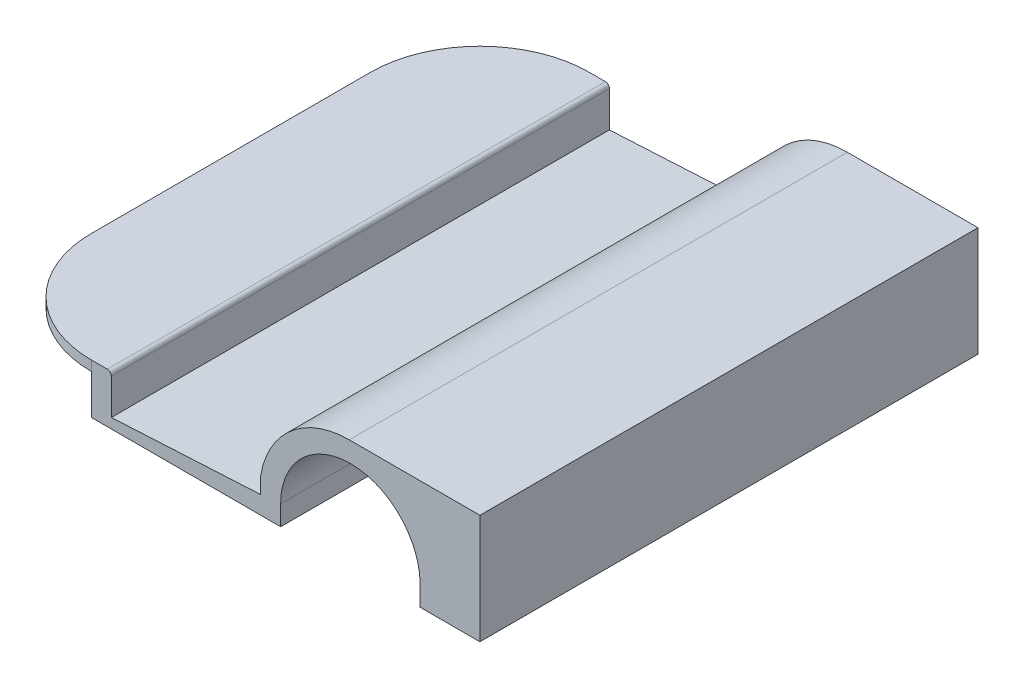
ISO-10303-21;
HEADER;
FILE_DESCRIPTION(('STEP AP214'),'2;1');
FILE_NAME('part.step','',(''),(''),'','','');
FILE_SCHEMA(('AUTOMOTIVE_DESIGN { 1 0 10303 214 1 1 1 1 }'));
ENDSEC;
DATA;
#1=APPLICATION_CONTEXT('core data for automotive mechanical design processes');
#2=APPLICATION_PROTOCOL_DEFINITION('international standard','automotive_design',2000,#1);
#3=PRODUCT_CONTEXT('',#1,'mechanical');
#4=PRODUCT('Part','Part','',(#3));
#5=PRODUCT_RELATED_PRODUCT_CATEGORY('part','',(#4));
#6=PRODUCT_DEFINITION_FORMATION('','',#4);
#7=PRODUCT_DEFINITION_CONTEXT('part definition',#1,'design');
#8=PRODUCT_DEFINITION('design','',#6,#7);
#9=PRODUCT_DEFINITION_SHAPE('','',#8);
#10=(LENGTH_UNIT() NAMED_UNIT(*) SI_UNIT(.MILLI.,.METRE.));
#11=(NAMED_UNIT(*) PLANE_ANGLE_UNIT() SI_UNIT($,.RADIAN.));
#12=(NAMED_UNIT(*) SI_UNIT($,.STERADIAN.) SOLID_ANGLE_UNIT());
#13=UNCERTAINTY_MEASURE_WITH_UNIT(LENGTH_MEASURE(1.E-05),#10,'distance_accuracy_value','');
#14=(GEOMETRIC_REPRESENTATION_CONTEXT(3) GLOBAL_UNCERTAINTY_ASSIGNED_CONTEXT((#13)) GLOBAL_UNIT_ASSIGNED_CONTEXT((#10,
#11,#12)) REPRESENTATION_CONTEXT('',''));
#15=CARTESIAN_POINT('',(0.,0.,0.));
#16=DIRECTION('',(0.,0.,1.));
#17=DIRECTION('',(1.,0.,0.));
#18=AXIS2_PLACEMENT_3D('',#15,#16,#17);
#19=CARTESIAN_POINT('',(0.,0.,250.));
#20=DIRECTION('',(1.,0.,0.));
#21=DIRECTION('',(0.,0.,-1.));
#22=AXIS2_PLACEMENT_3D('',#19,#20,#21);
#23=PLANE('',#22);
#24=DIRECTION('',(0.,0.,-1.));
#25=VECTOR('',#24,1.);
#26=CARTESIAN_POINT('',(0.,5.,250.));
#27=LINE('',#26,#25);
#28=CARTESIAN_POINT('',(0.,5.,195.));
#29=VERTEX_POINT('',#28);
#30=CARTESIAN_POINT('',(0.,5.,55.));
#31=VERTEX_POINT('',#30);
#32=EDGE_CURVE('E239',#29,#31,#27,.T.);
#33=ORIENTED_EDGE('',*,*,#32,.T.);
#34=DIRECTION('',(0.,-1.,0.));
#35=VECTOR('',#34,1.);
#36=CARTESIAN_POINT('',(0.,0.,55.));
#37=LINE('',#36,#35);
#38=CARTESIAN_POINT('',(0.,0.,55.));
#39=VERTEX_POINT('',#38);
#40=EDGE_CURVE('E171',#31,#39,#37,.T.);
#41=ORIENTED_EDGE('',*,*,#40,.T.);
#42=DIRECTION('',(0.,0.,-1.));
#43=VECTOR('',#42,1.);
#44=CARTESIAN_POINT('',(0.,0.,250.));
#45=LINE('',#44,#43);
#46=CARTESIAN_POINT('',(0.,0.,195.));
#47=VERTEX_POINT('',#46);
#48=EDGE_CURVE('E191',#47,#39,#45,.T.);
#49=ORIENTED_EDGE('',*,*,#48,.F.);
#50=DIRECTION('',(0.,-1.,0.));
#51=VECTOR('',#50,1.);
#52=CARTESIAN_POINT('',(0.,5.,195.));
#53=LINE('',#52,#51);
#54=EDGE_CURVE('E164',#47,#29,#53,.F.);
#55=ORIENTED_EDGE('',*,*,#54,.T.);
#56=EDGE_LOOP('',(#33,#41,#49,#55));
#57=FACE_BOUND('',#56,.T.);
#58=ADVANCED_FACE('F39',(#57),#23,.F.);
#59=CARTESIAN_POINT('',(0.,0.,250.));
#60=DIRECTION('',(0.,1.,0.));
#61=DIRECTION('',(0.,0.,1.));
#62=AXIS2_PLACEMENT_3D('',#59,#60,#61);
#63=PLANE('',#62);
#64=ORIENTED_EDGE('',*,*,#48,.T.);
#65=CARTESIAN_POINT('',(55.,0.,55.));
#66=DIRECTION('',(0.,1.,0.));
#67=DIRECTION('',(0.,0.,1.));
#68=AXIS2_PLACEMENT_3D('',#65,#66,#67);
#69=CIRCLE('',#68,55.);
#70=CARTESIAN_POINT('',(55.,0.,0.));
#71=VERTEX_POINT('',#70);
#72=EDGE_CURVE('E170',#39,#71,#69,.F.);
#73=ORIENTED_EDGE('',*,*,#72,.T.);
#74=DIRECTION('',(0.,0.,-1.));
#75=VECTOR('',#74,1.);
#76=CARTESIAN_POINT('',(55.,0.,250.));
#77=LINE('',#76,#75);
#78=CARTESIAN_POINT('',(55.,0.,250.));
#79=VERTEX_POINT('',#78);
#80=EDGE_CURVE('E186',#79,#71,#77,.T.);
#81=ORIENTED_EDGE('',*,*,#80,.F.);
#82=CARTESIAN_POINT('',(55.,0.,195.));
#83=DIRECTION('',(0.,1.,0.));
#84=DIRECTION('',(0.,0.,1.));
#85=AXIS2_PLACEMENT_3D('',#82,#83,#84);
#86=CIRCLE('',#85,55.);
#87=EDGE_CURVE('E159',#79,#47,#86,.F.);
#88=ORIENTED_EDGE('',*,*,#87,.T.);
#89=EDGE_LOOP('',(#64,#73,#81,#88));
#90=FACE_BOUND('',#89,.T.);
#91=ADVANCED_FACE('F187',(#90),#63,.F.);
#92=CARTESIAN_POINT('',(55.,0.,250.));
#93=DIRECTION('',(1.,0.,0.));
#94=DIRECTION('',(0.,0.,-1.));
#95=AXIS2_PLACEMENT_3D('',#92,#93,#94);
#96=PLANE('',#95);
#97=DIRECTION('',(0.,-1.,0.));
#98=VECTOR('',#97,1.);
#99=CARTESIAN_POINT('',(55.,0.,0.));
#100=LINE('',#99,#98);
#101=CARTESIAN_POINT('',(55.,-20.,0.));
#102=VERTEX_POINT('',#101);
#103=EDGE_CURVE('E240',#71,#102,#100,.T.);
#104=ORIENTED_EDGE('',*,*,#103,.T.);
#105=DIRECTION('',(0.,0.,-1.));
#106=VECTOR('',#105,1.);
#107=CARTESIAN_POINT('',(55.,-20.,250.));
#108=LINE('',#107,#106);
#109=CARTESIAN_POINT('',(55.,-20.,250.));
#110=VERTEX_POINT('',#109);
#111=EDGE_CURVE('E192',#110,#102,#108,.T.);
#112=ORIENTED_EDGE('',*,*,#111,.F.);
#113=DIRECTION('',(0.,-1.,0.));
#114=VECTOR('',#113,1.);
#115=CARTESIAN_POINT('',(55.,0.,250.));
#116=LINE('',#115,#114);
#117=EDGE_CURVE('E176',#79,#110,#116,.T.);
#118=ORIENTED_EDGE('',*,*,#117,.F.);
#119=ORIENTED_EDGE('',*,*,#80,.T.);
#120=EDGE_LOOP('',(#104,#112,#118,#119));
#121=FACE_BOUND('',#120,.T.);
#122=ADVANCED_FACE('F194',(#121),#96,.F.);
#123=CARTESIAN_POINT('',(55.,-20.,250.));
#124=DIRECTION('',(0.,1.,0.));
#125=DIRECTION('',(0.,0.,1.));
#126=AXIS2_PLACEMENT_3D('',#123,#124,#125);
#127=PLANE('',#126);
#128=DIRECTION('',(1.,0.,0.));
#129=VECTOR('',#128,1.);
#130=CARTESIAN_POINT('',(55.,-20.,0.));
#131=LINE('',#130,#129);
#132=CARTESIAN_POINT('',(150.,-20.,0.));
#133=VERTEX_POINT('',#132);
#134=EDGE_CURVE('E243',#102,#133,#131,.T.);
#135=ORIENTED_EDGE('',*,*,#134,.T.);
#136=DIRECTION('',(0.,0.,-1.));
#137=VECTOR('',#136,1.);
#138=CARTESIAN_POINT('',(150.,-20.,250.));
#139=LINE('',#138,#137);
#140=CARTESIAN_POINT('',(150.,-20.,250.));
#141=VERTEX_POINT('',#140);
#142=EDGE_CURVE('E314',#141,#133,#139,.T.);
#143=ORIENTED_EDGE('',*,*,#142,.F.);
#144=DIRECTION('',(1.,0.,0.));
#145=VECTOR('',#144,1.);
#146=CARTESIAN_POINT('',(55.,-20.,250.));
#147=LINE('',#146,#145);
#148=EDGE_CURVE('E198',#110,#141,#147,.T.);
#149=ORIENTED_EDGE('',*,*,#148,.F.);
#150=ORIENTED_EDGE('',*,*,#111,.T.);
#151=EDGE_LOOP('',(#135,#143,#149,#150));
#152=FACE_BOUND('',#151,.T.);
#153=ADVANCED_FACE('F420',(#152),#127,.F.);
#154=CARTESIAN_POINT('',(150.,-20.,250.));
#155=DIRECTION('',(-1.,0.,0.));
#156=DIRECTION('',(0.,-1.,0.));
#157=AXIS2_PLACEMENT_3D('',#154,#155,#156);
#158=PLANE('',#157);
#159=DIRECTION('',(0.,1.,0.));
#160=VECTOR('',#159,1.);
#161=CARTESIAN_POINT('',(150.,-20.,0.));
#162=LINE('',#161,#160);
#163=CARTESIAN_POINT('',(150.,-10.,0.));
#164=VERTEX_POINT('',#163);
#165=EDGE_CURVE('E246',#133,#164,#162,.T.);
#166=ORIENTED_EDGE('',*,*,#165,.T.);
#167=DIRECTION('',(0.,0.,-1.));
#168=VECTOR('',#167,1.);
#169=CARTESIAN_POINT('',(150.,-10.,250.));
#170=LINE('',#169,#168);
#171=CARTESIAN_POINT('',(150.,-10.,250.));
#172=VERTEX_POINT('',#171);
#173=EDGE_CURVE('E310',#172,#164,#170,.T.);
#174=ORIENTED_EDGE('',*,*,#173,.F.);
#175=DIRECTION('',(0.,1.,0.));
#176=VECTOR('',#175,1.);
#177=CARTESIAN_POINT('',(150.,-20.,250.));
#178=LINE('',#177,#176);
#179=EDGE_CURVE('E203',#141,#172,#178,.T.);
#180=ORIENTED_EDGE('',*,*,#179,.F.);
#181=ORIENTED_EDGE('',*,*,#142,.T.);
#182=EDGE_LOOP('',(#166,#174,#180,#181));
#183=FACE_BOUND('',#182,.T.);
#184=ADVANCED_FACE('F417',(#183),#158,.F.);
#185=CARTESIAN_POINT('',(185.,-9.99999999999999,250.));
#186=DIRECTION('',(0.,0.,-1.));
#187=DIRECTION('',(-1.,0.,0.));
#188=AXIS2_PLACEMENT_3D('',#185,#186,#187);
#189=CYLINDRICAL_SURFACE('',#188,35.);
#190=CARTESIAN_POINT('',(185.,-9.99999999999999,0.));
#191=DIRECTION('',(0.,0.,-1.));
#192=DIRECTION('',(-1.,0.,0.));
#193=AXIS2_PLACEMENT_3D('',#190,#191,#192);
#194=CIRCLE('',#193,35.);
#195=CARTESIAN_POINT('',(220.,-9.99999999999999,0.));
#196=VERTEX_POINT('',#195);
#197=EDGE_CURVE('E249',#164,#196,#194,.T.);
#198=ORIENTED_EDGE('',*,*,#197,.T.);
#199=DIRECTION('',(0.,0.,-1.));
#200=VECTOR('',#199,1.);
#201=CARTESIAN_POINT('',(220.,-9.99999999999999,250.));
#202=LINE('',#201,#200);
#203=CARTESIAN_POINT('',(220.,-9.99999999999999,250.));
#204=VERTEX_POINT('',#203);
#205=EDGE_CURVE('E306',#204,#196,#202,.T.);
#206=ORIENTED_EDGE('',*,*,#205,.F.);
#207=CARTESIAN_POINT('',(185.,-9.99999999999999,250.));
#208=DIRECTION('',(0.,0.,-1.));
#209=DIRECTION('',(-1.,0.,0.));
#210=AXIS2_PLACEMENT_3D('',#207,#208,#209);
#211=CIRCLE('',#210,35.);
#212=EDGE_CURVE('E210',#172,#204,#211,.T.);
#213=ORIENTED_EDGE('',*,*,#212,.F.);
#214=ORIENTED_EDGE('',*,*,#173,.T.);
#215=EDGE_LOOP('',(#198,#206,#213,#214));
#216=FACE_BOUND('',#215,.T.);
#217=ADVANCED_FACE('F413',(#216),#189,.F.);
#218=CARTESIAN_POINT('',(220.,-9.99999999999999,250.));
#219=DIRECTION('',(1.,0.,0.));
#220=DIRECTION('',(0.,0.,-1.));
#221=AXIS2_PLACEMENT_3D('',#218,#219,#220);
#222=PLANE('',#221);
#223=DIRECTION('',(0.,-1.,0.));
#224=VECTOR('',#223,1.);
#225=CARTESIAN_POINT('',(220.,-9.99999999999999,0.));
#226=LINE('',#225,#224);
#227=CARTESIAN_POINT('',(220.,-20.,0.));
#228=VERTEX_POINT('',#227);
#229=EDGE_CURVE('E252',#196,#228,#226,.T.);
#230=ORIENTED_EDGE('',*,*,#229,.T.);
#231=DIRECTION('',(0.,0.,-1.));
#232=VECTOR('',#231,1.);
#233=CARTESIAN_POINT('',(220.,-20.,250.));
#234=LINE('',#233,#232);
#235=CARTESIAN_POINT('',(220.,-20.,250.));
#236=VERTEX_POINT('',#235);
#237=EDGE_CURVE('E302',#236,#228,#234,.T.);
#238=ORIENTED_EDGE('',*,*,#237,.F.);
#239=DIRECTION('',(0.,-1.,0.));
#240=VECTOR('',#239,1.);
#241=CARTESIAN_POINT('',(220.,-9.99999999999999,250.));
#242=LINE('',#241,#240);
#243=EDGE_CURVE('E213',#204,#236,#242,.T.);
#244=ORIENTED_EDGE('',*,*,#243,.F.);
#245=ORIENTED_EDGE('',*,*,#205,.T.);
#246=EDGE_LOOP('',(#230,#238,#244,#245));
#247=FACE_BOUND('',#246,.T.);
#248=ADVANCED_FACE('F408',(#247),#222,.F.);
#249=CARTESIAN_POINT('',(220.,-20.,250.));
#250=DIRECTION('',(0.,1.,0.));
#251=DIRECTION('',(0.,0.,1.));
#252=AXIS2_PLACEMENT_3D('',#249,#250,#251);
#253=PLANE('',#252);
#254=DIRECTION('',(1.,0.,0.));
#255=VECTOR('',#254,1.);
#256=CARTESIAN_POINT('',(220.,-20.,0.));
#257=LINE('',#256,#255);
#258=CARTESIAN_POINT('',(250.,-20.,0.));
#259=VERTEX_POINT('',#258);
#260=EDGE_CURVE('E255',#228,#259,#257,.T.);
#261=ORIENTED_EDGE('',*,*,#260,.T.);
#262=DIRECTION('',(0.,0.,-1.));
#263=VECTOR('',#262,1.);
#264=CARTESIAN_POINT('',(250.,-20.,250.));
#265=LINE('',#264,#263);
#266=CARTESIAN_POINT('',(250.,-20.,250.));
#267=VERTEX_POINT('',#266);
#268=EDGE_CURVE('E298',#267,#259,#265,.T.);
#269=ORIENTED_EDGE('',*,*,#268,.F.);
#270=DIRECTION('',(1.,0.,0.));
#271=VECTOR('',#270,1.);
#272=CARTESIAN_POINT('',(220.,-20.,250.));
#273=LINE('',#272,#271);
#274=EDGE_CURVE('E216',#236,#267,#273,.T.);
#275=ORIENTED_EDGE('',*,*,#274,.F.);
#276=ORIENTED_EDGE('',*,*,#237,.T.);
#277=EDGE_LOOP('',(#261,#269,#275,#276));
#278=FACE_BOUND('',#277,.T.);
#279=ADVANCED_FACE('F402',(#278),#253,.F.);
#280=CARTESIAN_POINT('',(250.,-20.,250.));
#281=DIRECTION('',(-1.,0.,0.));
#282=DIRECTION('',(0.,0.,1.));
#283=AXIS2_PLACEMENT_3D('',#280,#281,#282);
#284=PLANE('',#283);
#285=DIRECTION('',(0.,1.,0.));
#286=VECTOR('',#285,1.);
#287=CARTESIAN_POINT('',(250.,-20.,0.));
#288=LINE('',#287,#286);
#289=CARTESIAN_POINT('',(250.,35.,0.));
#290=VERTEX_POINT('',#289);
#291=EDGE_CURVE('E258',#259,#290,#288,.T.);
#292=ORIENTED_EDGE('',*,*,#291,.T.);
#293=DIRECTION('',(0.,0.,-1.));
#294=VECTOR('',#293,1.);
#295=CARTESIAN_POINT('',(250.,35.,250.));
#296=LINE('',#295,#294);
#297=CARTESIAN_POINT('',(250.,35.,250.));
#298=VERTEX_POINT('',#297);
#299=EDGE_CURVE('E294',#298,#290,#296,.T.);
#300=ORIENTED_EDGE('',*,*,#299,.F.);
#301=DIRECTION('',(0.,1.,0.));
#302=VECTOR('',#301,1.);
#303=CARTESIAN_POINT('',(250.,-20.,250.));
#304=LINE('',#303,#302);
#305=EDGE_CURVE('E219',#267,#298,#304,.T.);
#306=ORIENTED_EDGE('',*,*,#305,.F.);
#307=ORIENTED_EDGE('',*,*,#268,.T.);
#308=EDGE_LOOP('',(#292,#300,#306,#307));
#309=FACE_BOUND('',#308,.T.);
#310=ADVANCED_FACE('F398',(#309),#284,.F.);
#311=CARTESIAN_POINT('',(250.,35.,250.));
#312=DIRECTION('',(0.,-1.,0.));
#313=DIRECTION('',(1.,0.,0.));
#314=AXIS2_PLACEMENT_3D('',#311,#312,#313);
#315=PLANE('',#314);
#316=DIRECTION('',(-1.,0.,0.));
#317=VECTOR('',#316,1.);
#318=CARTESIAN_POINT('',(250.,35.,0.));
#319=LINE('',#318,#317);
#320=CARTESIAN_POINT('',(184.403047162643,35.,0.));
#321=VERTEX_POINT('',#320);
#322=EDGE_CURVE('E261',#290,#321,#319,.T.);
#323=ORIENTED_EDGE('',*,*,#322,.T.);
#324=DIRECTION('',(0.,0.,-1.));
#325=VECTOR('',#324,1.);
#326=CARTESIAN_POINT('',(184.403047162643,35.,250.));
#327=LINE('',#326,#325);
#328=CARTESIAN_POINT('',(184.403047162643,35.,250.));
#329=VERTEX_POINT('',#328);
#330=EDGE_CURVE('E290',#329,#321,#327,.T.);
#331=ORIENTED_EDGE('',*,*,#330,.F.);
#332=DIRECTION('',(-1.,0.,0.));
#333=VECTOR('',#332,1.);
#334=CARTESIAN_POINT('',(250.,35.,250.));
#335=LINE('',#334,#333);
#336=EDGE_CURVE('E222',#298,#329,#335,.T.);
#337=ORIENTED_EDGE('',*,*,#336,.F.);
#338=ORIENTED_EDGE('',*,*,#299,.T.);
#339=EDGE_LOOP('',(#323,#331,#337,#338));
#340=FACE_BOUND('',#339,.T.);
#341=ADVANCED_FACE('F393',(#340),#315,.F.);
#342=CARTESIAN_POINT('',(184.403047162643,-9.99999999999999,250.));
#343=DIRECTION('',(0.,0.,-1.));
#344=DIRECTION('',(-1.,0.,0.));
#345=AXIS2_PLACEMENT_3D('',#342,#343,#344);
#346=CYLINDRICAL_SURFACE('',#345,45.);
#347=CARTESIAN_POINT('',(184.403047162643,-9.99999999999999,0.));
#348=DIRECTION('',(0.,0.,1.));
#349=DIRECTION('',(1.,0.,0.));
#350=AXIS2_PLACEMENT_3D('',#347,#348,#349);
#351=CIRCLE('',#350,45.);
#352=CARTESIAN_POINT('',(140.,-2.69456348517777,0.));
#353=VERTEX_POINT('',#352);
#354=EDGE_CURVE('E264',#321,#353,#351,.T.);
#355=ORIENTED_EDGE('',*,*,#354,.T.);
#356=DIRECTION('',(0.,0.,-1.));
#357=VECTOR('',#356,1.);
#358=CARTESIAN_POINT('',(140.,-2.69456348517777,250.));
#359=LINE('',#358,#357);
#360=CARTESIAN_POINT('',(140.,-2.69456348517777,250.));
#361=VERTEX_POINT('',#360);
#362=EDGE_CURVE('E286',#361,#353,#359,.T.);
#363=ORIENTED_EDGE('',*,*,#362,.F.);
#364=CARTESIAN_POINT('',(184.403047162643,-9.99999999999999,250.));
#365=DIRECTION('',(0.,0.,1.));
#366=DIRECTION('',(1.,0.,0.));
#367=AXIS2_PLACEMENT_3D('',#364,#365,#366);
#368=CIRCLE('',#367,45.);
#369=EDGE_CURVE('E225',#329,#361,#368,.T.);
#370=ORIENTED_EDGE('',*,*,#369,.F.);
#371=ORIENTED_EDGE('',*,*,#330,.T.);
#372=EDGE_LOOP('',(#355,#363,#370,#371));
#373=FACE_BOUND('',#372,.T.);
#374=ADVANCED_FACE('F387',(#373),#346,.T.);
#375=CARTESIAN_POINT('',(140.,-11.,250.));
#376=DIRECTION('',(1.,0.,0.));
#377=DIRECTION('',(0.,0.,-1.));
#378=AXIS2_PLACEMENT_3D('',#375,#376,#377);
#379=PLANE('',#378);
#380=DIRECTION('',(0.,-1.,0.));
#381=VECTOR('',#380,1.);
#382=CARTESIAN_POINT('',(140.,-11.,0.));
#383=LINE('',#382,#381);
#384=CARTESIAN_POINT('',(140.,-11.,0.));
#385=VERTEX_POINT('',#384);
#386=EDGE_CURVE('E267',#353,#385,#383,.T.);
#387=ORIENTED_EDGE('',*,*,#386,.T.);
#388=DIRECTION('',(0.,0.,-1.));
#389=VECTOR('',#388,1.);
#390=CARTESIAN_POINT('',(140.,-11.,250.));
#391=LINE('',#390,#389);
#392=CARTESIAN_POINT('',(140.,-11.,250.));
#393=VERTEX_POINT('',#392);
#394=EDGE_CURVE('E282',#393,#385,#391,.T.);
#395=ORIENTED_EDGE('',*,*,#394,.F.);
#396=DIRECTION('',(0.,-1.,0.));
#397=VECTOR('',#396,1.);
#398=CARTESIAN_POINT('',(140.,-11.,250.));
#399=LINE('',#398,#397);
#400=EDGE_CURVE('E228',#361,#393,#399,.T.);
#401=ORIENTED_EDGE('',*,*,#400,.F.);
#402=ORIENTED_EDGE('',*,*,#362,.T.);
#403=EDGE_LOOP('',(#387,#395,#401,#402));
#404=FACE_BOUND('',#403,.T.);
#405=ADVANCED_FACE('F383',(#404),#379,.F.);
#406=CARTESIAN_POINT('',(140.,-11.,250.));
#407=DIRECTION('',(0.0532576429161507,-0.998580804677827,0.));
#408=DIRECTION('',(0.998580804677827,0.0532576429161507,0.));
#409=AXIS2_PLACEMENT_3D('',#406,#407,#408);
#410=PLANE('',#409);
#411=DIRECTION('',(-0.998580804677827,-0.0532576429161507,0.));
#412=VECTOR('',#411,1.);
#413=CARTESIAN_POINT('',(140.,-11.,0.));
#414=LINE('',#413,#412);
#415=CARTESIAN_POINT('',(65.,-15.,0.));
#416=VERTEX_POINT('',#415);
#417=EDGE_CURVE('E270',#385,#416,#414,.T.);
#418=ORIENTED_EDGE('',*,*,#417,.T.);
#419=DIRECTION('',(0.,0.,-1.));
#420=VECTOR('',#419,1.);
#421=CARTESIAN_POINT('',(65.,-15.,250.));
#422=LINE('',#421,#420);
#423=CARTESIAN_POINT('',(65.,-15.,250.));
#424=VERTEX_POINT('',#423);
#425=EDGE_CURVE('E278',#424,#416,#422,.T.);
#426=ORIENTED_EDGE('',*,*,#425,.F.);
#427=DIRECTION('',(-0.998580804677827,-0.0532576429161507,0.));
#428=VECTOR('',#427,1.);
#429=CARTESIAN_POINT('',(140.,-11.,250.));
#430=LINE('',#429,#428);
#431=EDGE_CURVE('E231',#393,#424,#430,.T.);
#432=ORIENTED_EDGE('',*,*,#431,.F.);
#433=ORIENTED_EDGE('',*,*,#394,.T.);
#434=EDGE_LOOP('',(#418,#426,#432,#433));
#435=FACE_BOUND('',#434,.T.);
#436=ADVANCED_FACE('F379',(#435),#410,.F.);
#437=CARTESIAN_POINT('',(65.,5.,250.));
#438=DIRECTION('',(-1.,0.,0.));
#439=DIRECTION('',(0.,0.,1.));
#440=AXIS2_PLACEMENT_3D('',#437,#438,#439);
#441=PLANE('',#440);
#442=DIRECTION('',(0.,1.,0.));
#443=VECTOR('',#442,1.);
#444=CARTESIAN_POINT('',(65.,5.,0.));
#445=LINE('',#444,#443);
#446=CARTESIAN_POINT('',(65.,3.,0.));
#447=VERTEX_POINT('',#446);
#448=EDGE_CURVE('E205',#416,#447,#445,.T.);
#449=ORIENTED_EDGE('',*,*,#448,.T.);
#450=DIRECTION('',(0.,0.,-1.));
#451=VECTOR('',#450,1.);
#452=CARTESIAN_POINT('',(65.,3.,250.));
#453=LINE('',#452,#451);
#454=CARTESIAN_POINT('',(65.,3.,250.));
#455=VERTEX_POINT('',#454);
#456=EDGE_CURVE('E48',#447,#455,#453,.F.);
#457=ORIENTED_EDGE('',*,*,#456,.T.);
#458=DIRECTION('',(0.,1.,0.));
#459=VECTOR('',#458,1.);
#460=CARTESIAN_POINT('',(65.,5.,250.));
#461=LINE('',#460,#459);
#462=EDGE_CURVE('E234',#424,#455,#461,.T.);
#463=ORIENTED_EDGE('',*,*,#462,.F.);
#464=ORIENTED_EDGE('',*,*,#425,.T.);
#465=EDGE_LOOP('',(#449,#457,#463,#464));
#466=FACE_BOUND('',#465,.T.);
#467=ADVANCED_FACE('F374',(#466),#441,.F.);
#468=CARTESIAN_POINT('',(0.,5.,250.));
#469=DIRECTION('',(0.,-1.,0.));
#470=DIRECTION('',(0.,0.,-1.));
#471=AXIS2_PLACEMENT_3D('',#468,#469,#470);
#472=PLANE('',#471);
#473=DIRECTION('',(-1.,0.,0.));
#474=VECTOR('',#473,1.);
#475=CARTESIAN_POINT('',(0.,5.,250.));
#476=LINE('',#475,#474);
#477=CARTESIAN_POINT('',(63.,5.,250.));
#478=VERTEX_POINT('',#477);
#479=CARTESIAN_POINT('',(55.,5.,250.));
#480=VERTEX_POINT('',#479);
#481=EDGE_CURVE('E179',#478,#480,#476,.T.);
#482=ORIENTED_EDGE('',*,*,#481,.F.);
#483=DIRECTION('',(0.,0.,-1.));
#484=VECTOR('',#483,1.);
#485=CARTESIAN_POINT('',(63.,5.,250.));
#486=LINE('',#485,#484);
#487=CARTESIAN_POINT('',(63.,5.,0.));
#488=VERTEX_POINT('',#487);
#489=EDGE_CURVE('E182',#478,#488,#486,.T.);
#490=ORIENTED_EDGE('',*,*,#489,.T.);
#491=DIRECTION('',(-1.,0.,0.));
#492=VECTOR('',#491,1.);
#493=CARTESIAN_POINT('',(0.,5.,0.));
#494=LINE('',#493,#492);
#495=CARTESIAN_POINT('',(55.,5.,0.));
#496=VERTEX_POINT('',#495);
#497=EDGE_CURVE('E199',#488,#496,#494,.T.);
#498=ORIENTED_EDGE('',*,*,#497,.T.);
#499=CARTESIAN_POINT('',(55.,5.,55.));
#500=DIRECTION('',(0.,-1.,0.));
#501=DIRECTION('',(0.,0.,-1.));
#502=AXIS2_PLACEMENT_3D('',#499,#500,#501);
#503=CIRCLE('',#502,55.);
#504=EDGE_CURVE('E183',#496,#31,#503,.F.);
#505=ORIENTED_EDGE('',*,*,#504,.T.);
#506=ORIENTED_EDGE('',*,*,#32,.F.);
#507=CARTESIAN_POINT('',(55.,5.,195.));
#508=DIRECTION('',(0.,-1.,0.));
#509=DIRECTION('',(0.,0.,-1.));
#510=AXIS2_PLACEMENT_3D('',#507,#508,#509);
#511=CIRCLE('',#510,55.);
#512=EDGE_CURVE('E333',#29,#480,#511,.F.);
#513=ORIENTED_EDGE('',*,*,#512,.T.);
#514=EDGE_LOOP('',(#482,#490,#498,#505,#506,#513));
#515=FACE_BOUND('',#514,.T.);
#516=ADVANCED_FACE('F345',(#515),#472,.F.);
#517=CARTESIAN_POINT('',(184.403047162643,-9.99999999999999,250.));
#518=DIRECTION('',(0.,0.,1.));
#519=DIRECTION('',(1.,0.,0.));
#520=AXIS2_PLACEMENT_3D('',#517,#518,#519);
#521=PLANE('',#520);
#522=ORIENTED_EDGE('',*,*,#462,.T.);
#523=CARTESIAN_POINT('',(63.,3.,250.));
#524=DIRECTION('',(0.,0.,1.));
#525=DIRECTION('',(1.,0.,0.));
#526=AXIS2_PLACEMENT_3D('',#523,#524,#525);
#527=CIRCLE('',#526,2.);
#528=EDGE_CURVE('E11',#455,#478,#527,.T.);
#529=ORIENTED_EDGE('',*,*,#528,.T.);
#530=ORIENTED_EDGE('',*,*,#481,.T.);
#531=DIRECTION('',(0.,-1.,0.));
#532=VECTOR('',#531,1.);
#533=CARTESIAN_POINT('',(55.,0.,250.));
#534=LINE('',#533,#532);
#535=EDGE_CURVE('E163',#480,#79,#534,.T.);
#536=ORIENTED_EDGE('',*,*,#535,.T.);
#537=ORIENTED_EDGE('',*,*,#117,.T.);
#538=ORIENTED_EDGE('',*,*,#148,.T.);
#539=ORIENTED_EDGE('',*,*,#179,.T.);
#540=ORIENTED_EDGE('',*,*,#212,.T.);
#541=ORIENTED_EDGE('',*,*,#243,.T.);
#542=ORIENTED_EDGE('',*,*,#274,.T.);
#543=ORIENTED_EDGE('',*,*,#305,.T.);
#544=ORIENTED_EDGE('',*,*,#336,.T.);
#545=ORIENTED_EDGE('',*,*,#369,.T.);
#546=ORIENTED_EDGE('',*,*,#400,.T.);
#547=ORIENTED_EDGE('',*,*,#431,.T.);
#548=EDGE_LOOP('',(#522,#529,#530,#536,#537,#538,#539,#540,#541,#542,#543,#544,#545,#546,#547));
#549=FACE_BOUND('',#548,.T.);
#550=ADVANCED_FACE('F174',(#549),#521,.T.);
#551=CARTESIAN_POINT('',(184.403047162643,-9.99999999999999,0.));
#552=DIRECTION('',(0.,0.,1.));
#553=DIRECTION('',(1.,0.,0.));
#554=AXIS2_PLACEMENT_3D('',#551,#552,#553);
#555=PLANE('',#554);
#556=ORIENTED_EDGE('',*,*,#497,.F.);
#557=CARTESIAN_POINT('',(63.,3.,0.));
#558=DIRECTION('',(0.,0.,1.));
#559=DIRECTION('',(1.,0.,0.));
#560=AXIS2_PLACEMENT_3D('',#557,#558,#559);
#561=CIRCLE('',#560,2.);
#562=EDGE_CURVE('E62',#488,#447,#561,.F.);
#563=ORIENTED_EDGE('',*,*,#562,.T.);
#564=ORIENTED_EDGE('',*,*,#448,.F.);
#565=ORIENTED_EDGE('',*,*,#417,.F.);
#566=ORIENTED_EDGE('',*,*,#386,.F.);
#567=ORIENTED_EDGE('',*,*,#354,.F.);
#568=ORIENTED_EDGE('',*,*,#322,.F.);
#569=ORIENTED_EDGE('',*,*,#291,.F.);
#570=ORIENTED_EDGE('',*,*,#260,.F.);
#571=ORIENTED_EDGE('',*,*,#229,.F.);
#572=ORIENTED_EDGE('',*,*,#197,.F.);
#573=ORIENTED_EDGE('',*,*,#165,.F.);
#574=ORIENTED_EDGE('',*,*,#134,.F.);
#575=ORIENTED_EDGE('',*,*,#103,.F.);
#576=DIRECTION('',(0.,-1.,0.));
#577=VECTOR('',#576,1.);
#578=CARTESIAN_POINT('',(55.,-9.99999999999999,0.));
#579=LINE('',#578,#577);
#580=EDGE_CURVE('E329',#71,#496,#579,.F.);
#581=ORIENTED_EDGE('',*,*,#580,.T.);
#582=EDGE_LOOP('',(#556,#563,#564,#565,#566,#567,#568,#569,#570,#571,#572,#573,#574,#575,#581));
#583=FACE_BOUND('',#582,.T.);
#584=ADVANCED_FACE('F348',(#583),#555,.F.);
#585=CARTESIAN_POINT('',(55.,0.,55.));
#586=DIRECTION('',(0.,-1.,0.));
#587=DIRECTION('',(0.,0.,-1.));
#588=AXIS2_PLACEMENT_3D('',#585,#586,#587);
#589=CYLINDRICAL_SURFACE('',#588,55.);
#590=ORIENTED_EDGE('',*,*,#504,.F.);
#591=ORIENTED_EDGE('',*,*,#580,.F.);
#592=ORIENTED_EDGE('',*,*,#72,.F.);
#593=ORIENTED_EDGE('',*,*,#40,.F.);
#594=EDGE_LOOP('',(#590,#591,#592,#593));
#595=FACE_BOUND('',#594,.T.);
#596=ADVANCED_FACE('F354',(#595),#589,.T.);
#597=CARTESIAN_POINT('',(55.,-9.99999999999999,195.));
#598=DIRECTION('',(0.,1.,0.));
#599=DIRECTION('',(0.,0.,1.));
#600=AXIS2_PLACEMENT_3D('',#597,#598,#599);
#601=CYLINDRICAL_SURFACE('',#600,55.);
#602=ORIENTED_EDGE('',*,*,#512,.F.);
#603=ORIENTED_EDGE('',*,*,#54,.F.);
#604=ORIENTED_EDGE('',*,*,#87,.F.);
#605=ORIENTED_EDGE('',*,*,#535,.F.);
#606=EDGE_LOOP('',(#602,#603,#604,#605));
#607=FACE_BOUND('',#606,.T.);
#608=ADVANCED_FACE('F162',(#607),#601,.T.);
#609=CARTESIAN_POINT('',(63.,3.,250.));
#610=DIRECTION('',(0.,0.,-1.));
#611=DIRECTION('',(-1.,0.,0.));
#612=AXIS2_PLACEMENT_3D('',#609,#610,#611);
#613=CYLINDRICAL_SURFACE('',#612,2.);
#614=ORIENTED_EDGE('',*,*,#528,.F.);
#615=ORIENTED_EDGE('',*,*,#456,.F.);
#616=ORIENTED_EDGE('',*,*,#562,.F.);
#617=ORIENTED_EDGE('',*,*,#489,.F.);
#618=EDGE_LOOP('',(#614,#615,#616,#617));
#619=FACE_BOUND('',#618,.T.);
#620=ADVANCED_FACE('F41',(#619),#613,.T.);
#621=CLOSED_SHELL('',(#58,#91,#122,#153,#184,#217,#248,#279,#310,#341,#374,#405,#436,#467,#516,
#550,#584,#596,#608,#620));
#622=MANIFOLD_SOLID_BREP('B2',#621);
#623=ADVANCED_BREP_SHAPE_REPRESENTATION('',(#18,#622),#14);
#624=SHAPE_DEFINITION_REPRESENTATION(#9,#623);
ENDSEC;
END-ISO-10303-21;
